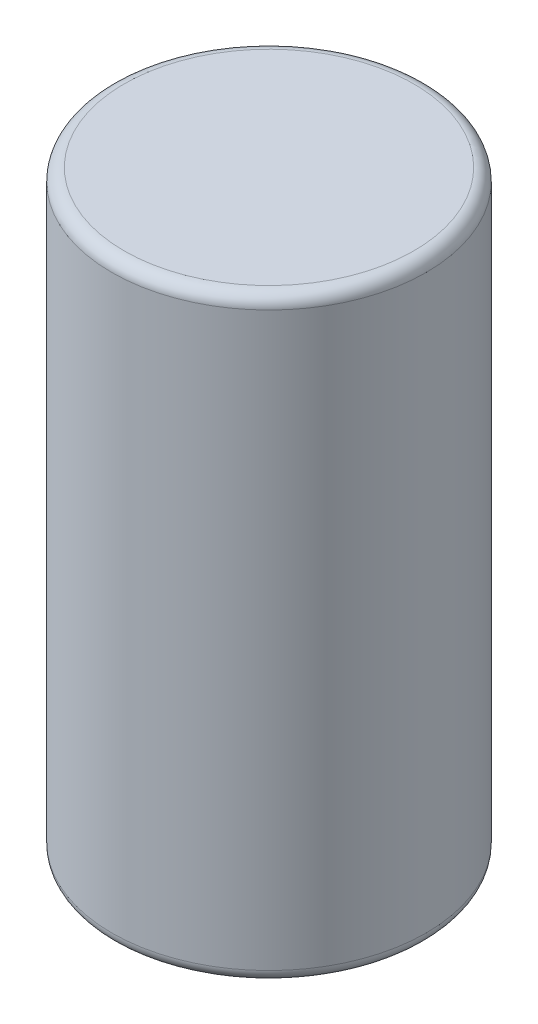
ISO-10303-21;
HEADER;
FILE_DESCRIPTION(('STEP AP214'),'2;1');
FILE_NAME('part.step','',(''),(''),'','','');
FILE_SCHEMA(('AUTOMOTIVE_DESIGN { 1 0 10303 214 1 1 1 1 }'));
ENDSEC;
DATA;
#1=APPLICATION_CONTEXT('core data for automotive mechanical design processes');
#2=APPLICATION_PROTOCOL_DEFINITION('international standard','automotive_design',2000,#1);
#3=PRODUCT_CONTEXT('',#1,'mechanical');
#4=PRODUCT('Part','Part','',(#3));
#5=PRODUCT_RELATED_PRODUCT_CATEGORY('part','',(#4));
#6=PRODUCT_DEFINITION_FORMATION('','',#4);
#7=PRODUCT_DEFINITION_CONTEXT('part definition',#1,'design');
#8=PRODUCT_DEFINITION('design','',#6,#7);
#9=PRODUCT_DEFINITION_SHAPE('','',#8);
#10=(LENGTH_UNIT() NAMED_UNIT(*) SI_UNIT(.MILLI.,.METRE.));
#11=(NAMED_UNIT(*) PLANE_ANGLE_UNIT() SI_UNIT($,.RADIAN.));
#12=(NAMED_UNIT(*) SI_UNIT($,.STERADIAN.) SOLID_ANGLE_UNIT());
#13=UNCERTAINTY_MEASURE_WITH_UNIT(LENGTH_MEASURE(1.E-05),#10,'distance_accuracy_value','');
#14=(GEOMETRIC_REPRESENTATION_CONTEXT(3) GLOBAL_UNCERTAINTY_ASSIGNED_CONTEXT((#13)) GLOBAL_UNIT_ASSIGNED_CONTEXT((#10,
#11,#12)) REPRESENTATION_CONTEXT('',''));
#15=CARTESIAN_POINT('',(0.,0.,0.));
#16=DIRECTION('',(0.,0.,1.));
#17=DIRECTION('',(1.,0.,0.));
#18=AXIS2_PLACEMENT_3D('',#15,#16,#17);
#19=CARTESIAN_POINT('',(0.,152.4,0.));
#20=DIRECTION('',(0.,-1.,0.));
#21=DIRECTION('',(0.,0.,-1.));
#22=AXIS2_PLACEMENT_3D('',#19,#20,#21);
#23=CYLINDRICAL_SURFACE('',#22,40.132);
#24=CARTESIAN_POINT('',(0.,3.17500000000001,0.));
#25=DIRECTION('',(0.,1.,0.));
#26=DIRECTION('',(0.,0.,1.));
#27=AXIS2_PLACEMENT_3D('',#24,#25,#26);
#28=CIRCLE('',#27,40.132);
#29=CARTESIAN_POINT('',(0.,3.17499999999998,-40.132));
#30=VERTEX_POINT('',#29);
#31=EDGE_CURVE('E50',#30,#30,#28,.T.);
#32=CARTESIAN_POINT('',(0.,149.225,0.));
#33=DIRECTION('',(0.,1.,0.));
#34=DIRECTION('',(0.,0.,1.));
#35=AXIS2_PLACEMENT_3D('',#32,#33,#34);
#36=CIRCLE('',#35,40.132);
#37=CARTESIAN_POINT('',(0.,149.225,-40.132));
#38=VERTEX_POINT('',#37);
#39=EDGE_CURVE('E55',#38,#38,#36,.F.);
#40=CARTESIAN_POINT('',(0.,3.17499999999998,-40.132));
#41=CARTESIAN_POINT('',(0.,4.69635416666665,-40.132));
#42=CARTESIAN_POINT('',(0.,6.21770833333331,-40.132));
#43=CARTESIAN_POINT('',(0.,9.26041666666664,-40.132));
#44=CARTESIAN_POINT('',(0.,10.7817708333333,-40.132));
#45=CARTESIAN_POINT('',(0.,13.8244791666666,-40.132));
#46=CARTESIAN_POINT('',(0.,15.3458333333333,-40.132));
#47=CARTESIAN_POINT('',(0.,18.3885416666667,-40.132));
#48=CARTESIAN_POINT('',(0.,19.9098958333333,-40.132));
#49=CARTESIAN_POINT('',(0.,22.9526041666666,-40.132));
#50=CARTESIAN_POINT('',(0.,24.4739583333333,-40.132));
#51=CARTESIAN_POINT('',(0.,27.5166666666666,-40.132));
#52=CARTESIAN_POINT('',(0.,29.0380208333333,-40.132));
#53=CARTESIAN_POINT('',(0.,32.0807291666666,-40.132));
#54=CARTESIAN_POINT('',(0.,33.6020833333333,-40.132));
#55=CARTESIAN_POINT('',(0.,36.6447916666666,-40.132));
#56=CARTESIAN_POINT('',(0.,38.1661458333333,-40.132));
#57=CARTESIAN_POINT('',(0.,41.2088541666666,-40.132));
#58=CARTESIAN_POINT('',(0.,42.7302083333333,-40.132));
#59=CARTESIAN_POINT('',(0.,45.7729166666666,-40.132));
#60=CARTESIAN_POINT('',(0.,47.2942708333333,-40.132));
#61=CARTESIAN_POINT('',(0.,50.3369791666666,-40.132));
#62=CARTESIAN_POINT('',(0.,51.8583333333333,-40.132));
#63=CARTESIAN_POINT('',(0.,54.9010416666666,-40.132));
#64=CARTESIAN_POINT('',(0.,56.4223958333333,-40.132));
#65=CARTESIAN_POINT('',(0.,59.4651041666666,-40.132));
#66=CARTESIAN_POINT('',(0.,60.9864583333333,-40.132));
#67=CARTESIAN_POINT('',(0.,64.0291666666666,-40.132));
#68=CARTESIAN_POINT('',(0.,65.5505208333333,-40.132));
#69=CARTESIAN_POINT('',(0.,68.5932291666666,-40.132));
#70=CARTESIAN_POINT('',(0.,70.1145833333333,-40.132));
#71=CARTESIAN_POINT('',(0.,73.1572916666667,-40.132));
#72=CARTESIAN_POINT('',(0.,74.6786458333333,-40.132));
#73=CARTESIAN_POINT('',(0.,77.7213541666666,-40.132));
#74=CARTESIAN_POINT('',(0.,79.2427083333333,-40.132));
#75=CARTESIAN_POINT('',(0.,82.2854166666666,-40.132));
#76=CARTESIAN_POINT('',(0.,83.8067708333333,-40.132));
#77=CARTESIAN_POINT('',(0.,86.8494791666666,-40.132));
#78=CARTESIAN_POINT('',(0.,88.3708333333333,-40.132));
#79=CARTESIAN_POINT('',(0.,91.4135416666666,-40.132));
#80=CARTESIAN_POINT('',(0.,92.9348958333333,-40.132));
#81=CARTESIAN_POINT('',(0.,95.9776041666666,-40.132));
#82=CARTESIAN_POINT('',(0.,97.4989583333333,-40.132));
#83=CARTESIAN_POINT('',(0.,100.541666666667,-40.132));
#84=CARTESIAN_POINT('',(0.,102.063020833333,-40.132));
#85=CARTESIAN_POINT('',(0.,105.105729166667,-40.132));
#86=CARTESIAN_POINT('',(0.,106.627083333333,-40.132));
#87=CARTESIAN_POINT('',(0.,109.669791666667,-40.132));
#88=CARTESIAN_POINT('',(0.,111.191145833333,-40.132));
#89=CARTESIAN_POINT('',(0.,114.233854166667,-40.132));
#90=CARTESIAN_POINT('',(0.,115.755208333333,-40.132));
#91=CARTESIAN_POINT('',(0.,118.797916666667,-40.132));
#92=CARTESIAN_POINT('',(0.,120.319270833333,-40.132));
#93=CARTESIAN_POINT('',(0.,123.361979166667,-40.132));
#94=CARTESIAN_POINT('',(0.,124.883333333333,-40.132));
#95=CARTESIAN_POINT('',(0.,127.926041666667,-40.132));
#96=CARTESIAN_POINT('',(0.,129.447395833333,-40.132));
#97=CARTESIAN_POINT('',(0.,132.490104166667,-40.132));
#98=CARTESIAN_POINT('',(0.,134.011458333333,-40.132));
#99=CARTESIAN_POINT('',(0.,137.054166666667,-40.132));
#100=CARTESIAN_POINT('',(0.,138.575520833333,-40.132));
#101=CARTESIAN_POINT('',(0.,141.618229166667,-40.132));
#102=CARTESIAN_POINT('',(0.,143.139583333333,-40.132));
#103=CARTESIAN_POINT('',(0.,146.182291666667,-40.132));
#104=CARTESIAN_POINT('',(0.,147.703645833333,-40.132));
#105=CARTESIAN_POINT('',(0.,149.225,-40.132));
#106=B_SPLINE_CURVE_WITH_KNOTS('',3,(#40,#41,#42,#43,#44,#45,#46,#47,#48,#49,#50,#51,#52,#53,
#54,#55,#56,#57,#58,#59,#60,#61,#62,#63,#64,#65,#66,#67,#68,#69,#70,#71,#72,#73,#74,#75,#76,#77,
#78,#79,#80,#81,#82,#83,#84,#85,#86,#87,#88,#89,#90,#91,#92,#93,#94,#95,#96,#97,#98,#99,#100,
#101,#102,#103,#104,#105),.UNSPECIFIED.,.F.,.F.,(4,2,2,2,2,2,2,2,2,2,2,2,2,2,2,2,2,2,2,2,2,2,2,
2,2,2,2,2,2,2,2,2,4),(0.,4.56406249999999,9.12812499999999,13.6921875,18.25625,22.8203125,
27.384375,31.9484375,36.5125,41.0765625,45.640625,50.2046875,54.76875,59.3328125,63.896875,
68.4609375,73.025,77.5890625,82.153125,86.7171875,91.28125,95.8453125,100.409375,104.9734375,
109.5375,114.1015625,118.665625,123.2296875,127.79375,132.3578125,136.921875,141.4859375,
146.05),.UNSPECIFIED.);
#107=EDGE_CURVE('BSEAM37',#30,#38,#106,.T.);
#108=ORIENTED_EDGE('',*,*,#31,.T.);
#109=ORIENTED_EDGE('',*,*,#39,.T.);
#110=ORIENTED_EDGE('',*,*,#107,.T.);
#111=ORIENTED_EDGE('',*,*,#107,.F.);
#112=EDGE_LOOP('',(#108,#110,#109,#111));
#113=FACE_BOUND('',#112,.T.);
#114=ADVANCED_FACE('F37',(#113),#23,.T.);
#115=CARTESIAN_POINT('',(0.,152.4,0.));
#116=DIRECTION('',(0.,1.,0.));
#117=DIRECTION('',(0.,0.,1.));
#118=AXIS2_PLACEMENT_3D('',#115,#116,#117);
#119=PLANE('',#118);
#120=CARTESIAN_POINT('',(0.,152.4,0.));
#121=DIRECTION('',(0.,1.,0.));
#122=DIRECTION('',(0.,0.,1.));
#123=AXIS2_PLACEMENT_3D('',#120,#121,#122);
#124=CIRCLE('',#123,36.957);
#125=CARTESIAN_POINT('',(0.,152.4,36.957));
#126=VERTEX_POINT('',#125);
#127=EDGE_CURVE('E10',#126,#126,#124,.T.);
#128=ORIENTED_EDGE('',*,*,#127,.T.);
#129=EDGE_LOOP('',(#128));
#130=FACE_BOUND('',#129,.T.);
#131=ADVANCED_FACE('F72',(#130),#119,.T.);
#132=CARTESIAN_POINT('',(0.,0.,0.));
#133=DIRECTION('',(0.,1.,0.));
#134=DIRECTION('',(0.,0.,1.));
#135=AXIS2_PLACEMENT_3D('',#132,#133,#134);
#136=PLANE('',#135);
#137=CARTESIAN_POINT('',(0.,0.,0.));
#138=DIRECTION('',(0.,1.,0.));
#139=DIRECTION('',(0.,0.,1.));
#140=AXIS2_PLACEMENT_3D('',#137,#138,#139);
#141=CIRCLE('',#140,36.957);
#142=CARTESIAN_POINT('',(0.,0.,36.957));
#143=VERTEX_POINT('',#142);
#144=EDGE_CURVE('E45',#143,#143,#141,.F.);
#145=ORIENTED_EDGE('',*,*,#144,.T.);
#146=EDGE_LOOP('',(#145));
#147=FACE_BOUND('',#146,.T.);
#148=ADVANCED_FACE('F69',(#147),#136,.F.);
#149=CARTESIAN_POINT('',(0.,3.17500000000001,0.));
#150=DIRECTION('',(0.,1.,0.));
#151=DIRECTION('',(0.,0.,1.));
#152=AXIS2_PLACEMENT_3D('',#149,#150,#151);
#153=TOROIDAL_SURFACE('',#152,36.957,3.175);
#154=ORIENTED_EDGE('',*,*,#144,.F.);
#155=EDGE_LOOP('',(#154));
#156=FACE_BOUND('',#155,.T.);
#157=ORIENTED_EDGE('',*,*,#31,.F.);
#158=EDGE_LOOP('',(#157));
#159=FACE_BOUND('',#158,.T.);
#160=ADVANCED_FACE('F65',(#156,#159),#153,.T.);
#161=CARTESIAN_POINT('',(0.,149.225,0.));
#162=DIRECTION('',(0.,1.,0.));
#163=DIRECTION('',(0.,0.,1.));
#164=AXIS2_PLACEMENT_3D('',#161,#162,#163);
#165=TOROIDAL_SURFACE('',#164,36.957,3.175);
#166=ORIENTED_EDGE('',*,*,#39,.F.);
#167=EDGE_LOOP('',(#166));
#168=FACE_BOUND('',#167,.T.);
#169=ORIENTED_EDGE('',*,*,#127,.F.);
#170=EDGE_LOOP('',(#169));
#171=FACE_BOUND('',#170,.T.);
#172=ADVANCED_FACE('F39',(#168,#171),#165,.T.);
#173=CLOSED_SHELL('',(#114,#131,#148,#160,#172));
#174=MANIFOLD_SOLID_BREP('B2',#173);
#175=ADVANCED_BREP_SHAPE_REPRESENTATION('',(#18,#174),#14);
#176=SHAPE_DEFINITION_REPRESENTATION(#9,#175);
ENDSEC;
END-ISO-10303-21;
